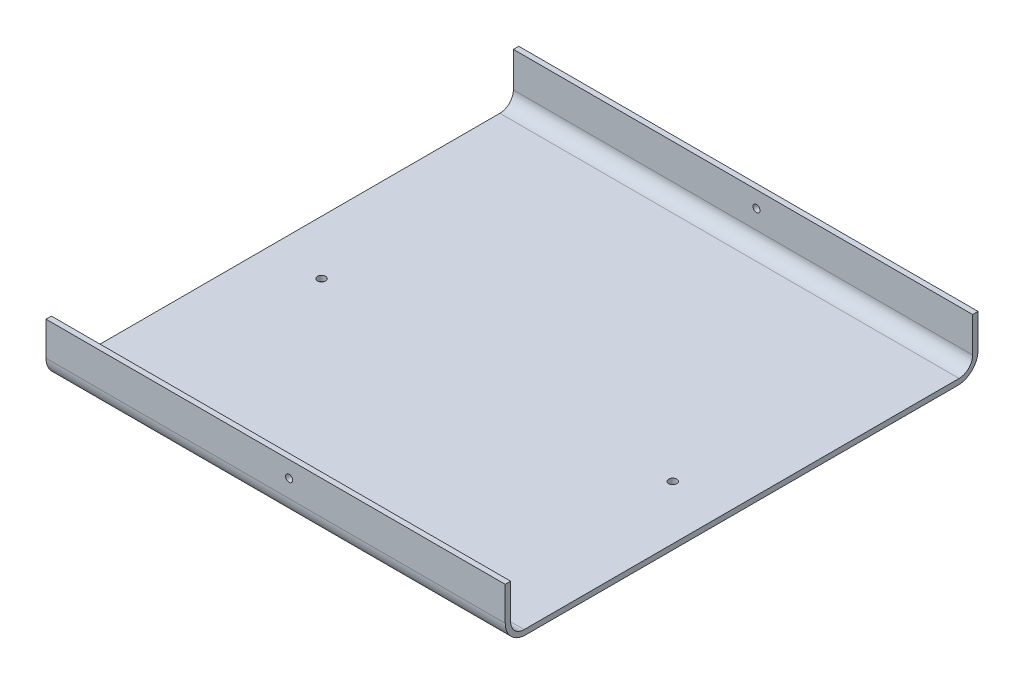
ISO-10303-21;
HEADER;
FILE_DESCRIPTION(('STEP AP214'),'2;1');
FILE_NAME('part.step','',(''),(''),'','','');
FILE_SCHEMA(('AUTOMOTIVE_DESIGN { 1 0 10303 214 1 1 1 1 }'));
ENDSEC;
DATA;
#1=APPLICATION_CONTEXT('core data for automotive mechanical design processes');
#2=APPLICATION_PROTOCOL_DEFINITION('international standard','automotive_design',2000,#1);
#3=PRODUCT_CONTEXT('',#1,'mechanical');
#4=PRODUCT('Part','Part','',(#3));
#5=PRODUCT_RELATED_PRODUCT_CATEGORY('part','',(#4));
#6=PRODUCT_DEFINITION_FORMATION('','',#4);
#7=PRODUCT_DEFINITION_CONTEXT('part definition',#1,'design');
#8=PRODUCT_DEFINITION('design','',#6,#7);
#9=PRODUCT_DEFINITION_SHAPE('','',#8);
#10=(LENGTH_UNIT() NAMED_UNIT(*) SI_UNIT(.MILLI.,.METRE.));
#11=(NAMED_UNIT(*) PLANE_ANGLE_UNIT() SI_UNIT($,.RADIAN.));
#12=(NAMED_UNIT(*) SI_UNIT($,.STERADIAN.) SOLID_ANGLE_UNIT());
#13=UNCERTAINTY_MEASURE_WITH_UNIT(LENGTH_MEASURE(1.E-05),#10,'distance_accuracy_value','');
#14=(GEOMETRIC_REPRESENTATION_CONTEXT(3) GLOBAL_UNCERTAINTY_ASSIGNED_CONTEXT((#13)) GLOBAL_UNIT_ASSIGNED_CONTEXT((#10,
#11,#12)) REPRESENTATION_CONTEXT('',''));
#15=CARTESIAN_POINT('',(0.,0.,0.));
#16=DIRECTION('',(0.,0.,1.));
#17=DIRECTION('',(1.,0.,0.));
#18=AXIS2_PLACEMENT_3D('',#15,#16,#17);
#19=CARTESIAN_POINT('',(170.,7.5,-80.));
#20=DIRECTION('',(-1.,0.,0.));
#21=DIRECTION('',(0.,0.,1.));
#22=AXIS2_PLACEMENT_3D('',#19,#20,#21);
#23=CYLINDRICAL_SURFACE('',#22,7.5);
#24=CARTESIAN_POINT('',(0.,7.5,-80.));
#25=DIRECTION('',(1.,0.,0.));
#26=DIRECTION('',(0.,0.,-1.));
#27=AXIS2_PLACEMENT_3D('',#24,#25,#26);
#28=CIRCLE('',#27,7.5);
#29=CARTESIAN_POINT('',(0.,0.,-80.));
#30=VERTEX_POINT('',#29);
#31=CARTESIAN_POINT('',(0.,7.5,-87.5));
#32=VERTEX_POINT('',#31);
#33=EDGE_CURVE('E172',#30,#32,#28,.T.);
#34=ORIENTED_EDGE('',*,*,#33,.T.);
#35=DIRECTION('',(-1.,0.,0.));
#36=VECTOR('',#35,1.);
#37=CARTESIAN_POINT('',(170.,7.5,-87.5));
#38=LINE('',#37,#36);
#39=CARTESIAN_POINT('',(170.,7.5,-87.5));
#40=VERTEX_POINT('',#39);
#41=EDGE_CURVE('E11',#40,#32,#38,.T.);
#42=ORIENTED_EDGE('',*,*,#41,.F.);
#43=CARTESIAN_POINT('',(170.,7.5,-80.));
#44=DIRECTION('',(1.,0.,0.));
#45=DIRECTION('',(0.,0.,-1.));
#46=AXIS2_PLACEMENT_3D('',#43,#44,#45);
#47=CIRCLE('',#46,7.5);
#48=CARTESIAN_POINT('',(170.,0.,-80.));
#49=VERTEX_POINT('',#48);
#50=EDGE_CURVE('E206',#49,#40,#47,.T.);
#51=ORIENTED_EDGE('',*,*,#50,.F.);
#52=DIRECTION('',(-1.,0.,0.));
#53=VECTOR('',#52,1.);
#54=CARTESIAN_POINT('',(170.,0.,-80.));
#55=LINE('',#54,#53);
#56=EDGE_CURVE('E168',#49,#30,#55,.T.);
#57=ORIENTED_EDGE('',*,*,#56,.T.);
#58=EDGE_LOOP('',(#34,#42,#51,#57));
#59=FACE_BOUND('',#58,.T.);
#60=ADVANCED_FACE('F45',(#59),#23,.T.);
#61=CARTESIAN_POINT('',(170.,7.5,-87.5));
#62=DIRECTION('',(0.,0.,1.));
#63=DIRECTION('',(1.,0.,0.));
#64=AXIS2_PLACEMENT_3D('',#61,#62,#63);
#65=PLANE('',#64);
#66=CARTESIAN_POINT('',(90.,14.,-87.5));
#67=DIRECTION('',(0.,0.,1.));
#68=DIRECTION('',(1.,0.,0.));
#69=AXIS2_PLACEMENT_3D('',#66,#67,#68);
#70=CIRCLE('',#69,1.29999999999999);
#71=CARTESIAN_POINT('',(91.3,14.,-87.5));
#72=VERTEX_POINT('',#71);
#73=EDGE_CURVE('E255',#72,#72,#70,.T.);
#74=ORIENTED_EDGE('',*,*,#73,.T.);
#75=EDGE_LOOP('',(#74));
#76=FACE_BOUND('',#75,.T.);
#77=DIRECTION('',(0.,1.,0.));
#78=VECTOR('',#77,1.);
#79=CARTESIAN_POINT('',(0.,7.5,-87.5));
#80=LINE('',#79,#78);
#81=CARTESIAN_POINT('',(0.,20.,-87.5));
#82=VERTEX_POINT('',#81);
#83=EDGE_CURVE('E176',#32,#82,#80,.T.);
#84=ORIENTED_EDGE('',*,*,#83,.T.);
#85=DIRECTION('',(-1.,0.,0.));
#86=VECTOR('',#85,1.);
#87=CARTESIAN_POINT('',(170.,20.,-87.5));
#88=LINE('',#87,#86);
#89=CARTESIAN_POINT('',(170.,20.,-87.5));
#90=VERTEX_POINT('',#89);
#91=EDGE_CURVE('E55',#90,#82,#88,.T.);
#92=ORIENTED_EDGE('',*,*,#91,.F.);
#93=DIRECTION('',(0.,1.,0.));
#94=VECTOR('',#93,1.);
#95=CARTESIAN_POINT('',(170.,7.5,-87.5));
#96=LINE('',#95,#94);
#97=EDGE_CURVE('E119',#40,#90,#96,.T.);
#98=ORIENTED_EDGE('',*,*,#97,.F.);
#99=ORIENTED_EDGE('',*,*,#41,.T.);
#100=EDGE_LOOP('',(#84,#92,#98,#99));
#101=FACE_BOUND('',#100,.T.);
#102=ADVANCED_FACE('F313',(#76,#101),#65,.F.);
#103=CARTESIAN_POINT('',(170.,20.,-87.5));
#104=DIRECTION('',(0.,-1.,0.));
#105=DIRECTION('',(0.,0.,-1.));
#106=AXIS2_PLACEMENT_3D('',#103,#104,#105);
#107=PLANE('',#106);
#108=DIRECTION('',(0.,0.,1.));
#109=VECTOR('',#108,1.);
#110=CARTESIAN_POINT('',(0.,20.,-87.5));
#111=LINE('',#110,#109);
#112=CARTESIAN_POINT('',(0.,20.,-85.5));
#113=VERTEX_POINT('',#112);
#114=EDGE_CURVE('E179',#82,#113,#111,.T.);
#115=ORIENTED_EDGE('',*,*,#114,.T.);
#116=DIRECTION('',(-1.,0.,0.));
#117=VECTOR('',#116,1.);
#118=CARTESIAN_POINT('',(170.,20.,-85.5));
#119=LINE('',#118,#117);
#120=CARTESIAN_POINT('',(170.,20.,-85.5));
#121=VERTEX_POINT('',#120);
#122=EDGE_CURVE('E233',#121,#113,#119,.T.);
#123=ORIENTED_EDGE('',*,*,#122,.F.);
#124=DIRECTION('',(0.,0.,1.));
#125=VECTOR('',#124,1.);
#126=CARTESIAN_POINT('',(170.,20.,-87.5));
#127=LINE('',#126,#125);
#128=EDGE_CURVE('E264',#90,#121,#127,.T.);
#129=ORIENTED_EDGE('',*,*,#128,.F.);
#130=ORIENTED_EDGE('',*,*,#91,.T.);
#131=EDGE_LOOP('',(#115,#123,#129,#130));
#132=FACE_BOUND('',#131,.T.);
#133=ADVANCED_FACE('F318',(#132),#107,.F.);
#134=CARTESIAN_POINT('',(170.,20.,-85.5));
#135=DIRECTION('',(0.,0.,-1.));
#136=DIRECTION('',(-1.,0.,0.));
#137=AXIS2_PLACEMENT_3D('',#134,#135,#136);
#138=PLANE('',#137);
#139=CARTESIAN_POINT('',(90.,14.,-85.5));
#140=DIRECTION('',(0.,0.,-1.));
#141=DIRECTION('',(-1.,0.,0.));
#142=AXIS2_PLACEMENT_3D('',#139,#140,#141);
#143=CIRCLE('',#142,1.29999999999999);
#144=CARTESIAN_POINT('',(88.7,14.,-85.5));
#145=VERTEX_POINT('',#144);
#146=EDGE_CURVE('E361',#145,#145,#143,.T.);
#147=ORIENTED_EDGE('',*,*,#146,.T.);
#148=EDGE_LOOP('',(#147));
#149=FACE_BOUND('',#148,.T.);
#150=DIRECTION('',(0.,-1.,0.));
#151=VECTOR('',#150,1.);
#152=CARTESIAN_POINT('',(0.,20.,-85.5));
#153=LINE('',#152,#151);
#154=CARTESIAN_POINT('',(0.,7.00000000000001,-85.5));
#155=VERTEX_POINT('',#154);
#156=EDGE_CURVE('E182',#113,#155,#153,.T.);
#157=ORIENTED_EDGE('',*,*,#156,.T.);
#158=DIRECTION('',(-1.,0.,0.));
#159=VECTOR('',#158,1.);
#160=CARTESIAN_POINT('',(170.,7.00000000000001,-85.5));
#161=LINE('',#160,#159);
#162=CARTESIAN_POINT('',(170.,7.00000000000001,-85.5));
#163=VERTEX_POINT('',#162);
#164=EDGE_CURVE('E229',#163,#155,#161,.T.);
#165=ORIENTED_EDGE('',*,*,#164,.F.);
#166=DIRECTION('',(0.,-1.,0.));
#167=VECTOR('',#166,1.);
#168=CARTESIAN_POINT('',(170.,20.,-85.5));
#169=LINE('',#168,#167);
#170=EDGE_CURVE('E267',#121,#163,#169,.T.);
#171=ORIENTED_EDGE('',*,*,#170,.F.);
#172=ORIENTED_EDGE('',*,*,#122,.T.);
#173=EDGE_LOOP('',(#157,#165,#171,#172));
#174=FACE_BOUND('',#173,.T.);
#175=ADVANCED_FACE('F324',(#149,#174),#138,.F.);
#176=CARTESIAN_POINT('',(170.,7.,-80.5));
#177=DIRECTION('',(-1.,0.,0.));
#178=DIRECTION('',(0.,0.,1.));
#179=AXIS2_PLACEMENT_3D('',#176,#177,#178);
#180=CYLINDRICAL_SURFACE('',#179,5.00000000000001);
#181=CARTESIAN_POINT('',(0.,7.,-80.5));
#182=DIRECTION('',(-1.,0.,0.));
#183=DIRECTION('',(0.,0.,1.));
#184=AXIS2_PLACEMENT_3D('',#181,#182,#183);
#185=CIRCLE('',#184,5.00000000000001);
#186=CARTESIAN_POINT('',(0.,2.00000000000001,-80.5));
#187=VERTEX_POINT('',#186);
#188=EDGE_CURVE('E185',#155,#187,#185,.T.);
#189=ORIENTED_EDGE('',*,*,#188,.T.);
#190=DIRECTION('',(-1.,0.,0.));
#191=VECTOR('',#190,1.);
#192=CARTESIAN_POINT('',(170.,2.00000000000001,-80.5));
#193=LINE('',#192,#191);
#194=CARTESIAN_POINT('',(170.,2.00000000000001,-80.5));
#195=VERTEX_POINT('',#194);
#196=EDGE_CURVE('E225',#195,#187,#193,.T.);
#197=ORIENTED_EDGE('',*,*,#196,.F.);
#198=CARTESIAN_POINT('',(170.,7.,-80.5));
#199=DIRECTION('',(-1.,0.,0.));
#200=DIRECTION('',(0.,0.,1.));
#201=AXIS2_PLACEMENT_3D('',#198,#199,#200);
#202=CIRCLE('',#201,5.00000000000001);
#203=EDGE_CURVE('E270',#163,#195,#202,.T.);
#204=ORIENTED_EDGE('',*,*,#203,.F.);
#205=ORIENTED_EDGE('',*,*,#164,.T.);
#206=EDGE_LOOP('',(#189,#197,#204,#205));
#207=FACE_BOUND('',#206,.T.);
#208=ADVANCED_FACE('F330',(#207),#180,.F.);
#209=CARTESIAN_POINT('',(170.,2.00000000000001,80.5));
#210=DIRECTION('',(0.,-1.,0.));
#211=DIRECTION('',(0.,0.,-1.));
#212=AXIS2_PLACEMENT_3D('',#209,#210,#211);
#213=PLANE('',#212);
#214=CARTESIAN_POINT('',(20.,2.00000000000001,5.49999999999999));
#215=DIRECTION('',(0.,1.,0.));
#216=DIRECTION('',(0.,0.,1.));
#217=AXIS2_PLACEMENT_3D('',#214,#215,#216);
#218=CIRCLE('',#217,1.5);
#219=CARTESIAN_POINT('',(20.,2.00000000000001,7.));
#220=VERTEX_POINT('',#219);
#221=EDGE_CURVE('E242',#220,#220,#218,.T.);
#222=ORIENTED_EDGE('',*,*,#221,.F.);
#223=EDGE_LOOP('',(#222));
#224=FACE_BOUND('',#223,.T.);
#225=CARTESIAN_POINT('',(150.,2.00000000000001,5.49999999999999));
#226=DIRECTION('',(0.,1.,0.));
#227=DIRECTION('',(0.,0.,-1.));
#228=AXIS2_PLACEMENT_3D('',#225,#226,#227);
#229=CIRCLE('',#228,1.50000000000002);
#230=CARTESIAN_POINT('',(150.,2.00000000000001,3.99999999999997));
#231=VERTEX_POINT('',#230);
#232=EDGE_CURVE('E249',#231,#231,#229,.T.);
#233=ORIENTED_EDGE('',*,*,#232,.F.);
#234=EDGE_LOOP('',(#233));
#235=FACE_BOUND('',#234,.T.);
#236=DIRECTION('',(0.,0.,1.));
#237=VECTOR('',#236,1.);
#238=CARTESIAN_POINT('',(0.,2.00000000000001,80.5));
#239=LINE('',#238,#237);
#240=CARTESIAN_POINT('',(0.,2.,80.5));
#241=VERTEX_POINT('',#240);
#242=EDGE_CURVE('E188',#187,#241,#239,.T.);
#243=ORIENTED_EDGE('',*,*,#242,.T.);
#244=DIRECTION('',(-1.,0.,0.));
#245=VECTOR('',#244,1.);
#246=CARTESIAN_POINT('',(170.,2.,80.5));
#247=LINE('',#246,#245);
#248=CARTESIAN_POINT('',(170.,2.,80.5));
#249=VERTEX_POINT('',#248);
#250=EDGE_CURVE('E221',#249,#241,#247,.T.);
#251=ORIENTED_EDGE('',*,*,#250,.F.);
#252=DIRECTION('',(0.,0.,1.));
#253=VECTOR('',#252,1.);
#254=CARTESIAN_POINT('',(170.,2.00000000000001,80.5));
#255=LINE('',#254,#253);
#256=EDGE_CURVE('E273',#195,#249,#255,.T.);
#257=ORIENTED_EDGE('',*,*,#256,.F.);
#258=ORIENTED_EDGE('',*,*,#196,.T.);
#259=EDGE_LOOP('',(#243,#251,#257,#258));
#260=FACE_BOUND('',#259,.T.);
#261=ADVANCED_FACE('F334',(#224,#235,#260),#213,.F.);
#262=CARTESIAN_POINT('',(170.,7.,80.5));
#263=DIRECTION('',(-1.,0.,0.));
#264=DIRECTION('',(0.,0.,1.));
#265=AXIS2_PLACEMENT_3D('',#262,#263,#264);
#266=CYLINDRICAL_SURFACE('',#265,5.00000000000001);
#267=CARTESIAN_POINT('',(0.,7.,80.5));
#268=DIRECTION('',(-1.,0.,0.));
#269=DIRECTION('',(0.,0.,-1.));
#270=AXIS2_PLACEMENT_3D('',#267,#268,#269);
#271=CIRCLE('',#270,5.00000000000001);
#272=CARTESIAN_POINT('',(0.,7.00000000000001,85.5));
#273=VERTEX_POINT('',#272);
#274=EDGE_CURVE('E191',#241,#273,#271,.T.);
#275=ORIENTED_EDGE('',*,*,#274,.T.);
#276=DIRECTION('',(-1.,0.,0.));
#277=VECTOR('',#276,1.);
#278=CARTESIAN_POINT('',(170.,7.00000000000001,85.5));
#279=LINE('',#278,#277);
#280=CARTESIAN_POINT('',(170.,7.00000000000001,85.5));
#281=VERTEX_POINT('',#280);
#282=EDGE_CURVE('E217',#281,#273,#279,.T.);
#283=ORIENTED_EDGE('',*,*,#282,.F.);
#284=CARTESIAN_POINT('',(170.,7.,80.5));
#285=DIRECTION('',(-1.,0.,0.));
#286=DIRECTION('',(0.,0.,-1.));
#287=AXIS2_PLACEMENT_3D('',#284,#285,#286);
#288=CIRCLE('',#287,5.00000000000001);
#289=EDGE_CURVE('E276',#249,#281,#288,.T.);
#290=ORIENTED_EDGE('',*,*,#289,.F.);
#291=ORIENTED_EDGE('',*,*,#250,.T.);
#292=EDGE_LOOP('',(#275,#283,#290,#291));
#293=FACE_BOUND('',#292,.T.);
#294=ADVANCED_FACE('F337',(#293),#266,.F.);
#295=CARTESIAN_POINT('',(170.,20.,85.5));
#296=DIRECTION('',(0.,0.,1.));
#297=DIRECTION('',(1.,0.,0.));
#298=AXIS2_PLACEMENT_3D('',#295,#296,#297);
#299=PLANE('',#298);
#300=CARTESIAN_POINT('',(90.,14.,85.5));
#301=DIRECTION('',(0.,0.,1.));
#302=DIRECTION('',(1.,0.,0.));
#303=AXIS2_PLACEMENT_3D('',#300,#301,#302);
#304=CIRCLE('',#303,1.29999999999999);
#305=CARTESIAN_POINT('',(91.3,14.,85.5));
#306=VERTEX_POINT('',#305);
#307=EDGE_CURVE('E357',#306,#306,#304,.T.);
#308=ORIENTED_EDGE('',*,*,#307,.T.);
#309=EDGE_LOOP('',(#308));
#310=FACE_BOUND('',#309,.T.);
#311=DIRECTION('',(0.,1.,0.));
#312=VECTOR('',#311,1.);
#313=CARTESIAN_POINT('',(0.,20.,85.5));
#314=LINE('',#313,#312);
#315=CARTESIAN_POINT('',(0.,20.,85.5));
#316=VERTEX_POINT('',#315);
#317=EDGE_CURVE('E194',#273,#316,#314,.T.);
#318=ORIENTED_EDGE('',*,*,#317,.T.);
#319=DIRECTION('',(-1.,0.,0.));
#320=VECTOR('',#319,1.);
#321=CARTESIAN_POINT('',(170.,20.,85.5));
#322=LINE('',#321,#320);
#323=CARTESIAN_POINT('',(170.,20.,85.5));
#324=VERTEX_POINT('',#323);
#325=EDGE_CURVE('E213',#324,#316,#322,.T.);
#326=ORIENTED_EDGE('',*,*,#325,.F.);
#327=DIRECTION('',(0.,1.,0.));
#328=VECTOR('',#327,1.);
#329=CARTESIAN_POINT('',(170.,20.,85.5));
#330=LINE('',#329,#328);
#331=EDGE_CURVE('E279',#281,#324,#330,.T.);
#332=ORIENTED_EDGE('',*,*,#331,.F.);
#333=ORIENTED_EDGE('',*,*,#282,.T.);
#334=EDGE_LOOP('',(#318,#326,#332,#333));
#335=FACE_BOUND('',#334,.T.);
#336=ADVANCED_FACE('F287',(#310,#335),#299,.F.);
#337=CARTESIAN_POINT('',(170.,20.,87.5));
#338=DIRECTION('',(0.,-1.,0.));
#339=DIRECTION('',(0.,0.,-1.));
#340=AXIS2_PLACEMENT_3D('',#337,#338,#339);
#341=PLANE('',#340);
#342=DIRECTION('',(0.,0.,1.));
#343=VECTOR('',#342,1.);
#344=CARTESIAN_POINT('',(0.,20.,87.5));
#345=LINE('',#344,#343);
#346=CARTESIAN_POINT('',(0.,20.,87.5));
#347=VERTEX_POINT('',#346);
#348=EDGE_CURVE('E197',#316,#347,#345,.T.);
#349=ORIENTED_EDGE('',*,*,#348,.T.);
#350=DIRECTION('',(-1.,0.,0.));
#351=VECTOR('',#350,1.);
#352=CARTESIAN_POINT('',(170.,20.,87.5));
#353=LINE('',#352,#351);
#354=CARTESIAN_POINT('',(170.,20.,87.5));
#355=VERTEX_POINT('',#354);
#356=EDGE_CURVE('E161',#355,#347,#353,.T.);
#357=ORIENTED_EDGE('',*,*,#356,.F.);
#358=DIRECTION('',(0.,0.,1.));
#359=VECTOR('',#358,1.);
#360=CARTESIAN_POINT('',(170.,20.,87.5));
#361=LINE('',#360,#359);
#362=EDGE_CURVE('E150',#324,#355,#361,.T.);
#363=ORIENTED_EDGE('',*,*,#362,.F.);
#364=ORIENTED_EDGE('',*,*,#325,.T.);
#365=EDGE_LOOP('',(#349,#357,#363,#364));
#366=FACE_BOUND('',#365,.T.);
#367=ADVANCED_FACE('F291',(#366),#341,.F.);
#368=CARTESIAN_POINT('',(170.,7.5,87.5));
#369=DIRECTION('',(0.,0.,-1.));
#370=DIRECTION('',(-1.,0.,0.));
#371=AXIS2_PLACEMENT_3D('',#368,#369,#370);
#372=PLANE('',#371);
#373=CARTESIAN_POINT('',(90.,14.,87.5));
#374=DIRECTION('',(0.,0.,1.));
#375=DIRECTION('',(1.,0.,0.));
#376=AXIS2_PLACEMENT_3D('',#373,#374,#375);
#377=CIRCLE('',#376,1.29999999999999);
#378=CARTESIAN_POINT('',(91.3,14.,87.5));
#379=VERTEX_POINT('',#378);
#380=EDGE_CURVE('E354',#379,#379,#377,.T.);
#381=ORIENTED_EDGE('',*,*,#380,.F.);
#382=EDGE_LOOP('',(#381));
#383=FACE_BOUND('',#382,.T.);
#384=DIRECTION('',(0.,-1.,0.));
#385=VECTOR('',#384,1.);
#386=CARTESIAN_POINT('',(0.,7.5,87.5));
#387=LINE('',#386,#385);
#388=CARTESIAN_POINT('',(0.,7.5,87.5));
#389=VERTEX_POINT('',#388);
#390=EDGE_CURVE('E159',#347,#389,#387,.T.);
#391=ORIENTED_EDGE('',*,*,#390,.T.);
#392=DIRECTION('',(-1.,0.,0.));
#393=VECTOR('',#392,1.);
#394=CARTESIAN_POINT('',(170.,7.5,87.5));
#395=LINE('',#394,#393);
#396=CARTESIAN_POINT('',(170.,7.5,87.5));
#397=VERTEX_POINT('',#396);
#398=EDGE_CURVE('E156',#397,#389,#395,.T.);
#399=ORIENTED_EDGE('',*,*,#398,.F.);
#400=DIRECTION('',(0.,-1.,0.));
#401=VECTOR('',#400,1.);
#402=CARTESIAN_POINT('',(170.,7.5,87.5));
#403=LINE('',#402,#401);
#404=EDGE_CURVE('E144',#355,#397,#403,.T.);
#405=ORIENTED_EDGE('',*,*,#404,.F.);
#406=ORIENTED_EDGE('',*,*,#356,.T.);
#407=EDGE_LOOP('',(#391,#399,#405,#406));
#408=FACE_BOUND('',#407,.T.);
#409=ADVANCED_FACE('F157',(#383,#408),#372,.F.);
#410=CARTESIAN_POINT('',(170.,7.5,80.));
#411=DIRECTION('',(-1.,0.,0.));
#412=DIRECTION('',(0.,0.,1.));
#413=AXIS2_PLACEMENT_3D('',#410,#411,#412);
#414=CYLINDRICAL_SURFACE('',#413,7.5);
#415=CARTESIAN_POINT('',(0.,7.5,80.));
#416=DIRECTION('',(1.,0.,0.));
#417=DIRECTION('',(0.,0.,1.));
#418=AXIS2_PLACEMENT_3D('',#415,#416,#417);
#419=CIRCLE('',#418,7.5);
#420=CARTESIAN_POINT('',(0.,0.,80.));
#421=VERTEX_POINT('',#420);
#422=EDGE_CURVE('E105',#389,#421,#419,.T.);
#423=ORIENTED_EDGE('',*,*,#422,.T.);
#424=DIRECTION('',(-1.,0.,0.));
#425=VECTOR('',#424,1.);
#426=CARTESIAN_POINT('',(170.,0.,80.));
#427=LINE('',#426,#425);
#428=CARTESIAN_POINT('',(170.,0.,80.));
#429=VERTEX_POINT('',#428);
#430=EDGE_CURVE('E162',#429,#421,#427,.T.);
#431=ORIENTED_EDGE('',*,*,#430,.F.);
#432=CARTESIAN_POINT('',(170.,7.5,80.));
#433=DIRECTION('',(1.,0.,0.));
#434=DIRECTION('',(0.,0.,1.));
#435=AXIS2_PLACEMENT_3D('',#432,#433,#434);
#436=CIRCLE('',#435,7.5);
#437=EDGE_CURVE('E148',#397,#429,#436,.T.);
#438=ORIENTED_EDGE('',*,*,#437,.F.);
#439=ORIENTED_EDGE('',*,*,#398,.T.);
#440=EDGE_LOOP('',(#423,#431,#438,#439));
#441=FACE_BOUND('',#440,.T.);
#442=ADVANCED_FACE('F164',(#441),#414,.T.);
#443=CARTESIAN_POINT('',(170.,0.,80.));
#444=DIRECTION('',(0.,1.,0.));
#445=DIRECTION('',(0.,0.,1.));
#446=AXIS2_PLACEMENT_3D('',#443,#444,#445);
#447=PLANE('',#446);
#448=CARTESIAN_POINT('',(20.,0.,5.49999999999999));
#449=DIRECTION('',(0.,1.,0.));
#450=DIRECTION('',(0.,0.,1.));
#451=AXIS2_PLACEMENT_3D('',#448,#449,#450);
#452=CIRCLE('',#451,1.5);
#453=CARTESIAN_POINT('',(20.,0.,7.));
#454=VERTEX_POINT('',#453);
#455=EDGE_CURVE('E48',#454,#454,#452,.T.);
#456=ORIENTED_EDGE('',*,*,#455,.T.);
#457=EDGE_LOOP('',(#456));
#458=FACE_BOUND('',#457,.T.);
#459=CARTESIAN_POINT('',(150.,0.,5.49999999999999));
#460=DIRECTION('',(0.,1.,0.));
#461=DIRECTION('',(0.,0.,1.));
#462=AXIS2_PLACEMENT_3D('',#459,#460,#461);
#463=CIRCLE('',#462,1.50000000000002);
#464=CARTESIAN_POINT('',(150.,0.,7.00000000000002));
#465=VERTEX_POINT('',#464);
#466=EDGE_CURVE('E239',#465,#465,#463,.T.);
#467=ORIENTED_EDGE('',*,*,#466,.T.);
#468=EDGE_LOOP('',(#467));
#469=FACE_BOUND('',#468,.T.);
#470=DIRECTION('',(0.,0.,-1.));
#471=VECTOR('',#470,1.);
#472=CARTESIAN_POINT('',(0.,0.,80.));
#473=LINE('',#472,#471);
#474=EDGE_CURVE('E111',#421,#30,#473,.T.);
#475=ORIENTED_EDGE('',*,*,#474,.T.);
#476=ORIENTED_EDGE('',*,*,#56,.F.);
#477=DIRECTION('',(0.,0.,-1.));
#478=VECTOR('',#477,1.);
#479=CARTESIAN_POINT('',(170.,0.,80.));
#480=LINE('',#479,#478);
#481=EDGE_CURVE('E64',#429,#49,#480,.T.);
#482=ORIENTED_EDGE('',*,*,#481,.F.);
#483=ORIENTED_EDGE('',*,*,#430,.T.);
#484=EDGE_LOOP('',(#475,#476,#482,#483));
#485=FACE_BOUND('',#484,.T.);
#486=ADVANCED_FACE('F299',(#458,#469,#485),#447,.F.);
#487=CARTESIAN_POINT('',(170.,7.5,-80.));
#488=DIRECTION('',(1.,0.,0.));
#489=DIRECTION('',(0.,0.,-1.));
#490=AXIS2_PLACEMENT_3D('',#487,#488,#489);
#491=PLANE('',#490);
#492=ORIENTED_EDGE('',*,*,#50,.T.);
#493=ORIENTED_EDGE('',*,*,#97,.T.);
#494=ORIENTED_EDGE('',*,*,#128,.T.);
#495=ORIENTED_EDGE('',*,*,#170,.T.);
#496=ORIENTED_EDGE('',*,*,#203,.T.);
#497=ORIENTED_EDGE('',*,*,#256,.T.);
#498=ORIENTED_EDGE('',*,*,#289,.T.);
#499=ORIENTED_EDGE('',*,*,#331,.T.);
#500=ORIENTED_EDGE('',*,*,#362,.T.);
#501=ORIENTED_EDGE('',*,*,#404,.T.);
#502=ORIENTED_EDGE('',*,*,#437,.T.);
#503=ORIENTED_EDGE('',*,*,#481,.T.);
#504=EDGE_LOOP('',(#492,#493,#494,#495,#496,#497,#498,#499,#500,#501,#502,#503));
#505=FACE_BOUND('',#504,.T.);
#506=ADVANCED_FACE('F146',(#505),#491,.T.);
#507=CARTESIAN_POINT('',(0.,7.5,-80.));
#508=DIRECTION('',(1.,0.,0.));
#509=DIRECTION('',(0.,0.,-1.));
#510=AXIS2_PLACEMENT_3D('',#507,#508,#509);
#511=PLANE('',#510);
#512=ORIENTED_EDGE('',*,*,#33,.F.);
#513=ORIENTED_EDGE('',*,*,#474,.F.);
#514=ORIENTED_EDGE('',*,*,#422,.F.);
#515=ORIENTED_EDGE('',*,*,#390,.F.);
#516=ORIENTED_EDGE('',*,*,#348,.F.);
#517=ORIENTED_EDGE('',*,*,#317,.F.);
#518=ORIENTED_EDGE('',*,*,#274,.F.);
#519=ORIENTED_EDGE('',*,*,#242,.F.);
#520=ORIENTED_EDGE('',*,*,#188,.F.);
#521=ORIENTED_EDGE('',*,*,#156,.F.);
#522=ORIENTED_EDGE('',*,*,#114,.F.);
#523=ORIENTED_EDGE('',*,*,#83,.F.);
#524=EDGE_LOOP('',(#512,#513,#514,#515,#516,#517,#518,#519,#520,#521,#522,#523));
#525=FACE_BOUND('',#524,.T.);
#526=ADVANCED_FACE('F294',(#525),#511,.F.);
#527=CARTESIAN_POINT('',(150.,-168.,5.49999999999999));
#528=DIRECTION('',(0.,1.,0.));
#529=DIRECTION('',(0.,0.,1.));
#530=AXIS2_PLACEMENT_3D('',#527,#528,#529);
#531=CYLINDRICAL_SURFACE('',#530,1.50000000000002);
#532=ORIENTED_EDGE('',*,*,#232,.T.);
#533=EDGE_LOOP('',(#532));
#534=FACE_BOUND('',#533,.T.);
#535=ORIENTED_EDGE('',*,*,#466,.F.);
#536=EDGE_LOOP('',(#535));
#537=FACE_BOUND('',#536,.T.);
#538=ADVANCED_FACE('F379',(#534,#537),#531,.F.);
#539=CARTESIAN_POINT('',(20.,-168.,5.49999999999999));
#540=DIRECTION('',(0.,1.,0.));
#541=DIRECTION('',(0.,0.,1.));
#542=AXIS2_PLACEMENT_3D('',#539,#540,#541);
#543=CYLINDRICAL_SURFACE('',#542,1.5);
#544=ORIENTED_EDGE('',*,*,#221,.T.);
#545=EDGE_LOOP('',(#544));
#546=FACE_BOUND('',#545,.T.);
#547=ORIENTED_EDGE('',*,*,#455,.F.);
#548=EDGE_LOOP('',(#547));
#549=FACE_BOUND('',#548,.T.);
#550=ADVANCED_FACE('F376',(#546,#549),#543,.F.);
#551=CARTESIAN_POINT('',(90.,14.,-112.5));
#552=DIRECTION('',(0.,0.,1.));
#553=DIRECTION('',(1.,0.,0.));
#554=AXIS2_PLACEMENT_3D('',#551,#552,#553);
#555=CYLINDRICAL_SURFACE('',#554,1.29999999999999);
#556=ORIENTED_EDGE('',*,*,#380,.T.);
#557=EDGE_LOOP('',(#556));
#558=FACE_BOUND('',#557,.T.);
#559=ORIENTED_EDGE('',*,*,#307,.F.);
#560=EDGE_LOOP('',(#559));
#561=FACE_BOUND('',#560,.T.);
#562=ADVANCED_FACE('F371',(#558,#561),#555,.F.);
#563=ORIENTED_EDGE('',*,*,#146,.F.);
#564=EDGE_LOOP('',(#563));
#565=FACE_BOUND('',#564,.T.);
#566=ORIENTED_EDGE('',*,*,#73,.F.);
#567=EDGE_LOOP('',(#566));
#568=FACE_BOUND('',#567,.T.);
#569=ADVANCED_FACE('F369',(#565,#568),#555,.F.);
#570=CLOSED_SHELL('',(#60,#102,#133,#175,#208,#261,#294,#336,#367,#409,#442,#486,#506,#526,#538,
#550,#562,#569));
#571=MANIFOLD_SOLID_BREP('B2',#570);
#572=ADVANCED_BREP_SHAPE_REPRESENTATION('',(#18,#571),#14);
#573=SHAPE_DEFINITION_REPRESENTATION(#9,#572);
ENDSEC;
END-ISO-10303-21;
